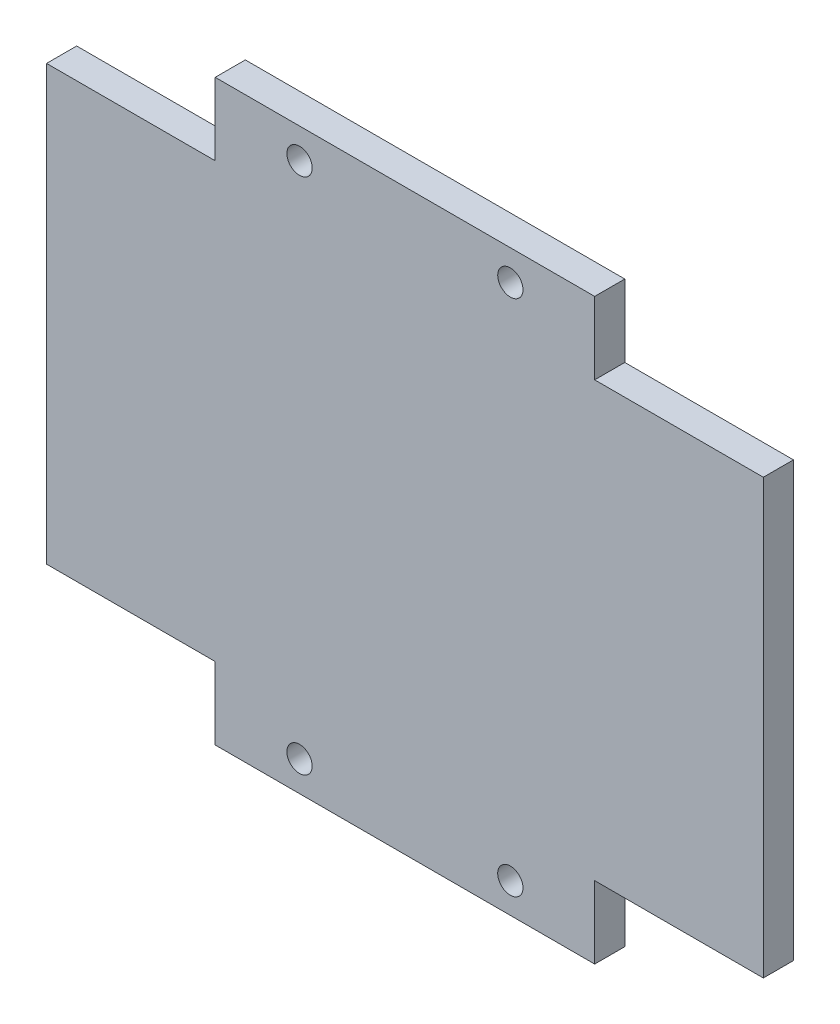
ISO-10303-21;
HEADER;
FILE_DESCRIPTION(('STEP AP214'),'2;1');
FILE_NAME('part.step','',(''),(''),'','','');
FILE_SCHEMA(('AUTOMOTIVE_DESIGN { 1 0 10303 214 1 1 1 1 }'));
ENDSEC;
DATA;
#1=APPLICATION_CONTEXT('core data for automotive mechanical design processes');
#2=APPLICATION_PROTOCOL_DEFINITION('international standard','automotive_design',2000,#1);
#3=PRODUCT_CONTEXT('',#1,'mechanical');
#4=PRODUCT('Part','Part','',(#3));
#5=PRODUCT_RELATED_PRODUCT_CATEGORY('part','',(#4));
#6=PRODUCT_DEFINITION_FORMATION('','',#4);
#7=PRODUCT_DEFINITION_CONTEXT('part definition',#1,'design');
#8=PRODUCT_DEFINITION('design','',#6,#7);
#9=PRODUCT_DEFINITION_SHAPE('','',#8);
#10=(LENGTH_UNIT() NAMED_UNIT(*) SI_UNIT(.MILLI.,.METRE.));
#11=(NAMED_UNIT(*) PLANE_ANGLE_UNIT() SI_UNIT($,.RADIAN.));
#12=(NAMED_UNIT(*) SI_UNIT($,.STERADIAN.) SOLID_ANGLE_UNIT());
#13=UNCERTAINTY_MEASURE_WITH_UNIT(LENGTH_MEASURE(1.E-05),#10,'distance_accuracy_value','');
#14=(GEOMETRIC_REPRESENTATION_CONTEXT(3) GLOBAL_UNCERTAINTY_ASSIGNED_CONTEXT((#13)) GLOBAL_UNIT_ASSIGNED_CONTEXT((#10,
#11,#12)) REPRESENTATION_CONTEXT('',''));
#15=CARTESIAN_POINT('',(0.,0.,0.));
#16=DIRECTION('',(0.,0.,1.));
#17=DIRECTION('',(1.,0.,0.));
#18=AXIS2_PLACEMENT_3D('',#15,#16,#17);
#19=CARTESIAN_POINT('',(0.,0.,5.));
#20=DIRECTION('',(1.,0.,0.));
#21=DIRECTION('',(0.,0.,-1.));
#22=AXIS2_PLACEMENT_3D('',#19,#20,#21);
#23=PLANE('',#22);
#24=DIRECTION('',(0.,0.,1.));
#25=VECTOR('',#24,1.);
#26=CARTESIAN_POINT('',(0.,12.,0.));
#27=LINE('',#26,#25);
#28=CARTESIAN_POINT('',(0.,12.,0.));
#29=VERTEX_POINT('',#28);
#30=CARTESIAN_POINT('',(0.,12.,5.));
#31=VERTEX_POINT('',#30);
#32=EDGE_CURVE('E135',#29,#31,#27,.T.);
#33=ORIENTED_EDGE('',*,*,#32,.F.);
#34=DIRECTION('',(0.,-1.,0.));
#35=VECTOR('',#34,1.);
#36=CARTESIAN_POINT('',(0.,0.,0.));
#37=LINE('',#36,#35);
#38=CARTESIAN_POINT('',(0.,0.,0.));
#39=VERTEX_POINT('',#38);
#40=EDGE_CURVE('E188',#29,#39,#37,.T.);
#41=ORIENTED_EDGE('',*,*,#40,.T.);
#42=DIRECTION('',(0.,0.,-1.));
#43=VECTOR('',#42,1.);
#44=CARTESIAN_POINT('',(0.,0.,5.));
#45=LINE('',#44,#43);
#46=CARTESIAN_POINT('',(0.,0.,5.));
#47=VERTEX_POINT('',#46);
#48=EDGE_CURVE('E11',#47,#39,#45,.T.);
#49=ORIENTED_EDGE('',*,*,#48,.F.);
#50=DIRECTION('',(0.,-1.,0.));
#51=VECTOR('',#50,1.);
#52=CARTESIAN_POINT('',(0.,0.,5.));
#53=LINE('',#52,#51);
#54=EDGE_CURVE('E151',#31,#47,#53,.T.);
#55=ORIENTED_EDGE('',*,*,#54,.F.);
#56=EDGE_LOOP('',(#33,#41,#49,#55));
#57=FACE_BOUND('',#56,.T.);
#58=ADVANCED_FACE('F45',(#57),#23,.F.);
#59=CARTESIAN_POINT('',(63.,0.,5.));
#60=DIRECTION('',(-1.,0.,0.));
#61=DIRECTION('',(0.,0.,1.));
#62=AXIS2_PLACEMENT_3D('',#59,#60,#61);
#63=PLANE('',#62);
#64=DIRECTION('',(0.,0.,1.));
#65=VECTOR('',#64,1.);
#66=CARTESIAN_POINT('',(63.,84.,0.));
#67=LINE('',#66,#65);
#68=CARTESIAN_POINT('',(63.,84.,0.));
#69=VERTEX_POINT('',#68);
#70=CARTESIAN_POINT('',(63.,84.,5.));
#71=VERTEX_POINT('',#70);
#72=EDGE_CURVE('E241',#69,#71,#67,.T.);
#73=ORIENTED_EDGE('',*,*,#72,.F.);
#74=DIRECTION('',(0.,1.,0.));
#75=VECTOR('',#74,1.);
#76=CARTESIAN_POINT('',(63.,0.,0.));
#77=LINE('',#76,#75);
#78=CARTESIAN_POINT('',(63.,96.,0.));
#79=VERTEX_POINT('',#78);
#80=EDGE_CURVE('E191',#69,#79,#77,.T.);
#81=ORIENTED_EDGE('',*,*,#80,.T.);
#82=DIRECTION('',(0.,0.,-1.));
#83=VECTOR('',#82,1.);
#84=CARTESIAN_POINT('',(63.,96.,5.));
#85=LINE('',#84,#83);
#86=CARTESIAN_POINT('',(63.,96.,5.));
#87=VERTEX_POINT('',#86);
#88=EDGE_CURVE('E198',#87,#79,#85,.T.);
#89=ORIENTED_EDGE('',*,*,#88,.F.);
#90=DIRECTION('',(0.,1.,0.));
#91=VECTOR('',#90,1.);
#92=CARTESIAN_POINT('',(63.,0.,5.));
#93=LINE('',#92,#91);
#94=EDGE_CURVE('E174',#71,#87,#93,.T.);
#95=ORIENTED_EDGE('',*,*,#94,.F.);
#96=EDGE_LOOP('',(#73,#81,#89,#95));
#97=FACE_BOUND('',#96,.T.);
#98=ADVANCED_FACE('F304',(#97),#63,.F.);
#99=CARTESIAN_POINT('',(0.,96.,0.));
#100=VERTEX_POINT('',#99);
#101=CARTESIAN_POINT('',(0.,84.,0.));
#102=VERTEX_POINT('',#101);
#103=EDGE_CURVE('E183',#100,#102,#37,.T.);
#104=ORIENTED_EDGE('',*,*,#103,.T.);
#105=DIRECTION('',(0.,0.,1.));
#106=VECTOR('',#105,1.);
#107=CARTESIAN_POINT('',(0.,84.,0.));
#108=LINE('',#107,#106);
#109=CARTESIAN_POINT('',(0.,84.,5.));
#110=VERTEX_POINT('',#109);
#111=EDGE_CURVE('E318',#102,#110,#108,.T.);
#112=ORIENTED_EDGE('',*,*,#111,.T.);
#113=CARTESIAN_POINT('',(0.,96.,5.));
#114=VERTEX_POINT('',#113);
#115=EDGE_CURVE('E160',#114,#110,#53,.T.);
#116=ORIENTED_EDGE('',*,*,#115,.F.);
#117=DIRECTION('',(0.,0.,-1.));
#118=VECTOR('',#117,1.);
#119=CARTESIAN_POINT('',(0.,96.,5.));
#120=LINE('',#119,#118);
#121=EDGE_CURVE('E182',#114,#100,#120,.T.);
#122=ORIENTED_EDGE('',*,*,#121,.T.);
#123=EDGE_LOOP('',(#104,#112,#116,#122));
#124=FACE_BOUND('',#123,.T.);
#125=ADVANCED_FACE('F47',(#124),#23,.F.);
#126=CARTESIAN_POINT('',(0.,0.,5.));
#127=DIRECTION('',(0.,1.,0.));
#128=DIRECTION('',(0.,0.,1.));
#129=AXIS2_PLACEMENT_3D('',#126,#127,#128);
#130=PLANE('',#129);
#131=DIRECTION('',(1.,0.,0.));
#132=VECTOR('',#131,1.);
#133=CARTESIAN_POINT('',(0.,0.,0.));
#134=LINE('',#133,#132);
#135=CARTESIAN_POINT('',(63.,0.,0.));
#136=VERTEX_POINT('',#135);
#137=EDGE_CURVE('E187',#39,#136,#134,.T.);
#138=ORIENTED_EDGE('',*,*,#137,.T.);
#139=DIRECTION('',(0.,0.,-1.));
#140=VECTOR('',#139,1.);
#141=CARTESIAN_POINT('',(63.,0.,5.));
#142=LINE('',#141,#140);
#143=CARTESIAN_POINT('',(63.,0.,5.));
#144=VERTEX_POINT('',#143);
#145=EDGE_CURVE('E54',#144,#136,#142,.T.);
#146=ORIENTED_EDGE('',*,*,#145,.F.);
#147=DIRECTION('',(1.,0.,0.));
#148=VECTOR('',#147,1.);
#149=CARTESIAN_POINT('',(0.,0.,5.));
#150=LINE('',#149,#148);
#151=EDGE_CURVE('E165',#47,#144,#150,.T.);
#152=ORIENTED_EDGE('',*,*,#151,.F.);
#153=ORIENTED_EDGE('',*,*,#48,.T.);
#154=EDGE_LOOP('',(#138,#146,#152,#153));
#155=FACE_BOUND('',#154,.T.);
#156=ADVANCED_FACE('F312',(#155),#130,.F.);
#157=CARTESIAN_POINT('',(63.,12.,0.));
#158=VERTEX_POINT('',#157);
#159=EDGE_CURVE('E166',#136,#158,#77,.T.);
#160=ORIENTED_EDGE('',*,*,#159,.T.);
#161=DIRECTION('',(0.,0.,1.));
#162=VECTOR('',#161,1.);
#163=CARTESIAN_POINT('',(63.,12.,0.));
#164=LINE('',#163,#162);
#165=CARTESIAN_POINT('',(63.,12.,5.));
#166=VERTEX_POINT('',#165);
#167=EDGE_CURVE('E235',#158,#166,#164,.T.);
#168=ORIENTED_EDGE('',*,*,#167,.T.);
#169=EDGE_CURVE('E175',#144,#166,#93,.T.);
#170=ORIENTED_EDGE('',*,*,#169,.F.);
#171=ORIENTED_EDGE('',*,*,#145,.T.);
#172=EDGE_LOOP('',(#160,#168,#170,#171));
#173=FACE_BOUND('',#172,.T.);
#174=ADVANCED_FACE('F207',(#173),#63,.F.);
#175=CARTESIAN_POINT('',(0.,96.,5.));
#176=DIRECTION('',(0.,-1.,0.));
#177=DIRECTION('',(0.,0.,-1.));
#178=AXIS2_PLACEMENT_3D('',#175,#176,#177);
#179=PLANE('',#178);
#180=DIRECTION('',(-1.,0.,0.));
#181=VECTOR('',#180,1.);
#182=CARTESIAN_POINT('',(0.,96.,0.));
#183=LINE('',#182,#181);
#184=EDGE_CURVE('E161',#79,#100,#183,.T.);
#185=ORIENTED_EDGE('',*,*,#184,.T.);
#186=ORIENTED_EDGE('',*,*,#121,.F.);
#187=DIRECTION('',(-1.,0.,0.));
#188=VECTOR('',#187,1.);
#189=CARTESIAN_POINT('',(0.,96.,5.));
#190=LINE('',#189,#188);
#191=EDGE_CURVE('E179',#87,#114,#190,.T.);
#192=ORIENTED_EDGE('',*,*,#191,.F.);
#193=ORIENTED_EDGE('',*,*,#88,.T.);
#194=EDGE_LOOP('',(#185,#186,#192,#193));
#195=FACE_BOUND('',#194,.T.);
#196=ADVANCED_FACE('F288',(#195),#179,.F.);
#197=CARTESIAN_POINT('',(0.,0.,5.));
#198=DIRECTION('',(0.,0.,-1.));
#199=DIRECTION('',(-1.,0.,0.));
#200=AXIS2_PLACEMENT_3D('',#197,#198,#199);
#201=PLANE('',#200);
#202=CARTESIAN_POINT('',(14.,5.,5.));
#203=DIRECTION('',(0.,0.,1.));
#204=DIRECTION('',(-1.,0.,0.));
#205=AXIS2_PLACEMENT_3D('',#202,#203,#204);
#206=CIRCLE('',#205,2.1);
#207=CARTESIAN_POINT('',(11.9,5.,5.));
#208=VERTEX_POINT('',#207);
#209=EDGE_CURVE('E269',#208,#208,#206,.T.);
#210=ORIENTED_EDGE('',*,*,#209,.F.);
#211=EDGE_LOOP('',(#210));
#212=FACE_BOUND('',#211,.T.);
#213=CARTESIAN_POINT('',(49.,5.00000000000002,5.));
#214=DIRECTION('',(0.,0.,1.));
#215=DIRECTION('',(1.,0.,0.));
#216=AXIS2_PLACEMENT_3D('',#213,#214,#215);
#217=CIRCLE('',#216,2.1);
#218=CARTESIAN_POINT('',(51.1,5.00000000000002,5.));
#219=VERTEX_POINT('',#218);
#220=EDGE_CURVE('E261',#219,#219,#217,.T.);
#221=ORIENTED_EDGE('',*,*,#220,.F.);
#222=EDGE_LOOP('',(#221));
#223=FACE_BOUND('',#222,.T.);
#224=CARTESIAN_POINT('',(49.,91.,5.));
#225=DIRECTION('',(0.,0.,1.));
#226=DIRECTION('',(-1.,0.,0.));
#227=AXIS2_PLACEMENT_3D('',#224,#225,#226);
#228=CIRCLE('',#227,2.1);
#229=CARTESIAN_POINT('',(46.9,91.,5.));
#230=VERTEX_POINT('',#229);
#231=EDGE_CURVE('E253',#230,#230,#228,.T.);
#232=ORIENTED_EDGE('',*,*,#231,.F.);
#233=EDGE_LOOP('',(#232));
#234=FACE_BOUND('',#233,.T.);
#235=CARTESIAN_POINT('',(14.,91.,5.));
#236=DIRECTION('',(0.,0.,1.));
#237=DIRECTION('',(1.,0.,0.));
#238=AXIS2_PLACEMENT_3D('',#235,#236,#237);
#239=CIRCLE('',#238,2.1);
#240=CARTESIAN_POINT('',(16.1,91.,5.));
#241=VERTEX_POINT('',#240);
#242=EDGE_CURVE('E170',#241,#241,#239,.T.);
#243=ORIENTED_EDGE('',*,*,#242,.F.);
#244=EDGE_LOOP('',(#243));
#245=FACE_BOUND('',#244,.T.);
#246=ORIENTED_EDGE('',*,*,#115,.T.);
#247=DIRECTION('',(-1.,0.,0.));
#248=VECTOR('',#247,1.);
#249=CARTESIAN_POINT('',(0.,84.,5.));
#250=LINE('',#249,#248);
#251=CARTESIAN_POINT('',(-28.,84.,5.));
#252=VERTEX_POINT('',#251);
#253=EDGE_CURVE('E61',#110,#252,#250,.T.);
#254=ORIENTED_EDGE('',*,*,#253,.T.);
#255=DIRECTION('',(0.,-1.,0.));
#256=VECTOR('',#255,1.);
#257=CARTESIAN_POINT('',(-28.,84.,5.));
#258=LINE('',#257,#256);
#259=CARTESIAN_POINT('',(-28.,12.,5.));
#260=VERTEX_POINT('',#259);
#261=EDGE_CURVE('E154',#252,#260,#258,.T.);
#262=ORIENTED_EDGE('',*,*,#261,.T.);
#263=DIRECTION('',(1.,0.,0.));
#264=VECTOR('',#263,1.);
#265=CARTESIAN_POINT('',(0.,12.,5.));
#266=LINE('',#265,#264);
#267=EDGE_CURVE('E138',#260,#31,#266,.T.);
#268=ORIENTED_EDGE('',*,*,#267,.T.);
#269=ORIENTED_EDGE('',*,*,#54,.T.);
#270=ORIENTED_EDGE('',*,*,#151,.T.);
#271=ORIENTED_EDGE('',*,*,#169,.T.);
#272=DIRECTION('',(1.,0.,0.));
#273=VECTOR('',#272,1.);
#274=CARTESIAN_POINT('',(63.,12.,5.));
#275=LINE('',#274,#273);
#276=CARTESIAN_POINT('',(91.,12.,5.));
#277=VERTEX_POINT('',#276);
#278=EDGE_CURVE('E69',#166,#277,#275,.T.);
#279=ORIENTED_EDGE('',*,*,#278,.T.);
#280=DIRECTION('',(0.,1.,0.));
#281=VECTOR('',#280,1.);
#282=CARTESIAN_POINT('',(91.,84.,5.));
#283=LINE('',#282,#281);
#284=CARTESIAN_POINT('',(91.,84.,5.));
#285=VERTEX_POINT('',#284);
#286=EDGE_CURVE('E228',#277,#285,#283,.T.);
#287=ORIENTED_EDGE('',*,*,#286,.T.);
#288=DIRECTION('',(-1.,0.,0.));
#289=VECTOR('',#288,1.);
#290=CARTESIAN_POINT('',(63.,84.,5.));
#291=LINE('',#290,#289);
#292=EDGE_CURVE('E221',#285,#71,#291,.T.);
#293=ORIENTED_EDGE('',*,*,#292,.T.);
#294=ORIENTED_EDGE('',*,*,#94,.T.);
#295=ORIENTED_EDGE('',*,*,#191,.T.);
#296=EDGE_LOOP('',(#246,#254,#262,#268,#269,#270,#271,#279,#287,#293,#294,#295));
#297=FACE_BOUND('',#296,.T.);
#298=ADVANCED_FACE('F150',(#212,#223,#234,#245,#297),#201,.F.);
#299=CARTESIAN_POINT('',(0.,0.,0.));
#300=DIRECTION('',(0.,0.,-1.));
#301=DIRECTION('',(-1.,0.,0.));
#302=AXIS2_PLACEMENT_3D('',#299,#300,#301);
#303=PLANE('',#302);
#304=CARTESIAN_POINT('',(14.,5.,0.));
#305=DIRECTION('',(0.,0.,1.));
#306=DIRECTION('',(-1.,0.,0.));
#307=AXIS2_PLACEMENT_3D('',#304,#305,#306);
#308=CIRCLE('',#307,2.1);
#309=CARTESIAN_POINT('',(11.9,5.,0.));
#310=VERTEX_POINT('',#309);
#311=EDGE_CURVE('E244',#310,#310,#308,.T.);
#312=ORIENTED_EDGE('',*,*,#311,.T.);
#313=EDGE_LOOP('',(#312));
#314=FACE_BOUND('',#313,.T.);
#315=CARTESIAN_POINT('',(49.,5.00000000000002,0.));
#316=DIRECTION('',(0.,0.,1.));
#317=DIRECTION('',(1.,0.,0.));
#318=AXIS2_PLACEMENT_3D('',#315,#316,#317);
#319=CIRCLE('',#318,2.1);
#320=CARTESIAN_POINT('',(51.1,5.00000000000002,0.));
#321=VERTEX_POINT('',#320);
#322=EDGE_CURVE('E265',#321,#321,#319,.T.);
#323=ORIENTED_EDGE('',*,*,#322,.T.);
#324=EDGE_LOOP('',(#323));
#325=FACE_BOUND('',#324,.T.);
#326=CARTESIAN_POINT('',(49.,91.,0.));
#327=DIRECTION('',(0.,0.,1.));
#328=DIRECTION('',(-1.,0.,0.));
#329=AXIS2_PLACEMENT_3D('',#326,#327,#328);
#330=CIRCLE('',#329,2.1);
#331=CARTESIAN_POINT('',(46.9,91.,0.));
#332=VERTEX_POINT('',#331);
#333=EDGE_CURVE('E257',#332,#332,#330,.T.);
#334=ORIENTED_EDGE('',*,*,#333,.T.);
#335=EDGE_LOOP('',(#334));
#336=FACE_BOUND('',#335,.T.);
#337=CARTESIAN_POINT('',(14.,91.,0.));
#338=DIRECTION('',(0.,0.,1.));
#339=DIRECTION('',(1.,0.,0.));
#340=AXIS2_PLACEMENT_3D('',#337,#338,#339);
#341=CIRCLE('',#340,2.1);
#342=CARTESIAN_POINT('',(16.1,91.,0.));
#343=VERTEX_POINT('',#342);
#344=EDGE_CURVE('E275',#343,#343,#341,.T.);
#345=ORIENTED_EDGE('',*,*,#344,.T.);
#346=EDGE_LOOP('',(#345));
#347=FACE_BOUND('',#346,.T.);
#348=ORIENTED_EDGE('',*,*,#103,.F.);
#349=ORIENTED_EDGE('',*,*,#184,.F.);
#350=ORIENTED_EDGE('',*,*,#80,.F.);
#351=DIRECTION('',(-1.,0.,0.));
#352=VECTOR('',#351,1.);
#353=CARTESIAN_POINT('',(63.,84.,0.));
#354=LINE('',#353,#352);
#355=CARTESIAN_POINT('',(91.,84.,0.));
#356=VERTEX_POINT('',#355);
#357=EDGE_CURVE('E225',#356,#69,#354,.T.);
#358=ORIENTED_EDGE('',*,*,#357,.F.);
#359=DIRECTION('',(0.,1.,0.));
#360=VECTOR('',#359,1.);
#361=CARTESIAN_POINT('',(91.,84.,0.));
#362=LINE('',#361,#360);
#363=CARTESIAN_POINT('',(91.,12.,0.));
#364=VERTEX_POINT('',#363);
#365=EDGE_CURVE('E219',#364,#356,#362,.T.);
#366=ORIENTED_EDGE('',*,*,#365,.F.);
#367=DIRECTION('',(1.,0.,0.));
#368=VECTOR('',#367,1.);
#369=CARTESIAN_POINT('',(63.,12.,0.));
#370=LINE('',#369,#368);
#371=EDGE_CURVE('E216',#158,#364,#370,.T.);
#372=ORIENTED_EDGE('',*,*,#371,.F.);
#373=ORIENTED_EDGE('',*,*,#159,.F.);
#374=ORIENTED_EDGE('',*,*,#137,.F.);
#375=ORIENTED_EDGE('',*,*,#40,.F.);
#376=DIRECTION('',(1.,0.,0.));
#377=VECTOR('',#376,1.);
#378=CARTESIAN_POINT('',(0.,12.,0.));
#379=LINE('',#378,#377);
#380=CARTESIAN_POINT('',(-28.,12.,0.));
#381=VERTEX_POINT('',#380);
#382=EDGE_CURVE('E140',#381,#29,#379,.T.);
#383=ORIENTED_EDGE('',*,*,#382,.F.);
#384=DIRECTION('',(0.,-1.,0.));
#385=VECTOR('',#384,1.);
#386=CARTESIAN_POINT('',(-28.,84.,0.));
#387=LINE('',#386,#385);
#388=CARTESIAN_POINT('',(-28.,84.,0.));
#389=VERTEX_POINT('',#388);
#390=EDGE_CURVE('E326',#389,#381,#387,.T.);
#391=ORIENTED_EDGE('',*,*,#390,.F.);
#392=DIRECTION('',(-1.,0.,0.));
#393=VECTOR('',#392,1.);
#394=CARTESIAN_POINT('',(0.,84.,0.));
#395=LINE('',#394,#393);
#396=EDGE_CURVE('E156',#102,#389,#395,.T.);
#397=ORIENTED_EDGE('',*,*,#396,.F.);
#398=EDGE_LOOP('',(#348,#349,#350,#358,#366,#372,#373,#374,#375,#383,#391,#397));
#399=FACE_BOUND('',#398,.T.);
#400=ADVANCED_FACE('F213',(#314,#325,#336,#347,#399),#303,.T.);
#401=CARTESIAN_POINT('',(14.,91.,0.));
#402=DIRECTION('',(0.,0.,1.));
#403=DIRECTION('',(1.,0.,0.));
#404=AXIS2_PLACEMENT_3D('',#401,#402,#403);
#405=CYLINDRICAL_SURFACE('',#404,2.1);
#406=ORIENTED_EDGE('',*,*,#344,.F.);
#407=EDGE_LOOP('',(#406));
#408=FACE_BOUND('',#407,.T.);
#409=ORIENTED_EDGE('',*,*,#242,.T.);
#410=EDGE_LOOP('',(#409));
#411=FACE_BOUND('',#410,.T.);
#412=ADVANCED_FACE('F285',(#408,#411),#405,.F.);
#413=CARTESIAN_POINT('',(49.,91.,0.));
#414=DIRECTION('',(0.,0.,1.));
#415=DIRECTION('',(1.,0.,0.));
#416=AXIS2_PLACEMENT_3D('',#413,#414,#415);
#417=CYLINDRICAL_SURFACE('',#416,2.1);
#418=ORIENTED_EDGE('',*,*,#333,.F.);
#419=EDGE_LOOP('',(#418));
#420=FACE_BOUND('',#419,.T.);
#421=ORIENTED_EDGE('',*,*,#231,.T.);
#422=EDGE_LOOP('',(#421));
#423=FACE_BOUND('',#422,.T.);
#424=ADVANCED_FACE('F367',(#420,#423),#417,.F.);
#425=CARTESIAN_POINT('',(49.,5.00000000000002,0.));
#426=DIRECTION('',(0.,0.,1.));
#427=DIRECTION('',(1.,0.,0.));
#428=AXIS2_PLACEMENT_3D('',#425,#426,#427);
#429=CYLINDRICAL_SURFACE('',#428,2.1);
#430=ORIENTED_EDGE('',*,*,#322,.F.);
#431=EDGE_LOOP('',(#430));
#432=FACE_BOUND('',#431,.T.);
#433=ORIENTED_EDGE('',*,*,#220,.T.);
#434=EDGE_LOOP('',(#433));
#435=FACE_BOUND('',#434,.T.);
#436=ADVANCED_FACE('F370',(#432,#435),#429,.F.);
#437=CARTESIAN_POINT('',(14.,5.,0.));
#438=DIRECTION('',(0.,0.,1.));
#439=DIRECTION('',(1.,0.,0.));
#440=AXIS2_PLACEMENT_3D('',#437,#438,#439);
#441=CYLINDRICAL_SURFACE('',#440,2.1);
#442=ORIENTED_EDGE('',*,*,#311,.F.);
#443=EDGE_LOOP('',(#442));
#444=FACE_BOUND('',#443,.T.);
#445=ORIENTED_EDGE('',*,*,#209,.T.);
#446=EDGE_LOOP('',(#445));
#447=FACE_BOUND('',#446,.T.);
#448=ADVANCED_FACE('F374',(#444,#447),#441,.F.);
#449=CARTESIAN_POINT('',(63.,84.,0.));
#450=DIRECTION('',(0.,1.,0.));
#451=DIRECTION('',(0.,0.,1.));
#452=AXIS2_PLACEMENT_3D('',#449,#450,#451);
#453=PLANE('',#452);
#454=ORIENTED_EDGE('',*,*,#292,.F.);
#455=DIRECTION('',(0.,0.,1.));
#456=VECTOR('',#455,1.);
#457=CARTESIAN_POINT('',(91.,84.,0.));
#458=LINE('',#457,#456);
#459=EDGE_CURVE('E245',#356,#285,#458,.T.);
#460=ORIENTED_EDGE('',*,*,#459,.F.);
#461=ORIENTED_EDGE('',*,*,#357,.T.);
#462=ORIENTED_EDGE('',*,*,#72,.T.);
#463=EDGE_LOOP('',(#454,#460,#461,#462));
#464=FACE_BOUND('',#463,.T.);
#465=ADVANCED_FACE('F352',(#464),#453,.T.);
#466=CARTESIAN_POINT('',(91.,84.,0.));
#467=DIRECTION('',(1.,0.,0.));
#468=DIRECTION('',(0.,1.,0.));
#469=AXIS2_PLACEMENT_3D('',#466,#467,#468);
#470=PLANE('',#469);
#471=ORIENTED_EDGE('',*,*,#286,.F.);
#472=DIRECTION('',(0.,0.,1.));
#473=VECTOR('',#472,1.);
#474=CARTESIAN_POINT('',(91.,12.,0.));
#475=LINE('',#474,#473);
#476=EDGE_CURVE('E248',#364,#277,#475,.T.);
#477=ORIENTED_EDGE('',*,*,#476,.F.);
#478=ORIENTED_EDGE('',*,*,#365,.T.);
#479=ORIENTED_EDGE('',*,*,#459,.T.);
#480=EDGE_LOOP('',(#471,#477,#478,#479));
#481=FACE_BOUND('',#480,.T.);
#482=ADVANCED_FACE('F355',(#481),#470,.T.);
#483=CARTESIAN_POINT('',(63.,12.,0.));
#484=DIRECTION('',(0.,-1.,0.));
#485=DIRECTION('',(1.,0.,0.));
#486=AXIS2_PLACEMENT_3D('',#483,#484,#485);
#487=PLANE('',#486);
#488=ORIENTED_EDGE('',*,*,#278,.F.);
#489=ORIENTED_EDGE('',*,*,#167,.F.);
#490=ORIENTED_EDGE('',*,*,#371,.T.);
#491=ORIENTED_EDGE('',*,*,#476,.T.);
#492=EDGE_LOOP('',(#488,#489,#490,#491));
#493=FACE_BOUND('',#492,.T.);
#494=ADVANCED_FACE('F356',(#493),#487,.T.);
#495=CARTESIAN_POINT('',(0.,12.,0.));
#496=DIRECTION('',(0.,-1.,0.));
#497=DIRECTION('',(0.,0.,-1.));
#498=AXIS2_PLACEMENT_3D('',#495,#496,#497);
#499=PLANE('',#498);
#500=ORIENTED_EDGE('',*,*,#267,.F.);
#501=DIRECTION('',(0.,0.,1.));
#502=VECTOR('',#501,1.);
#503=CARTESIAN_POINT('',(-28.,12.,0.));
#504=LINE('',#503,#502);
#505=EDGE_CURVE('E145',#381,#260,#504,.T.);
#506=ORIENTED_EDGE('',*,*,#505,.F.);
#507=ORIENTED_EDGE('',*,*,#382,.T.);
#508=ORIENTED_EDGE('',*,*,#32,.T.);
#509=EDGE_LOOP('',(#500,#506,#507,#508));
#510=FACE_BOUND('',#509,.T.);
#511=ADVANCED_FACE('F137',(#510),#499,.T.);
#512=CARTESIAN_POINT('',(-28.,84.,0.));
#513=DIRECTION('',(-1.,0.,0.));
#514=DIRECTION('',(0.,-1.,0.));
#515=AXIS2_PLACEMENT_3D('',#512,#513,#514);
#516=PLANE('',#515);
#517=ORIENTED_EDGE('',*,*,#261,.F.);
#518=DIRECTION('',(0.,0.,1.));
#519=VECTOR('',#518,1.);
#520=CARTESIAN_POINT('',(-28.,84.,0.));
#521=LINE('',#520,#519);
#522=EDGE_CURVE('E339',#389,#252,#521,.T.);
#523=ORIENTED_EDGE('',*,*,#522,.F.);
#524=ORIENTED_EDGE('',*,*,#390,.T.);
#525=ORIENTED_EDGE('',*,*,#505,.T.);
#526=EDGE_LOOP('',(#517,#523,#524,#525));
#527=FACE_BOUND('',#526,.T.);
#528=ADVANCED_FACE('F344',(#527),#516,.T.);
#529=CARTESIAN_POINT('',(0.,84.,0.));
#530=DIRECTION('',(0.,1.,0.));
#531=DIRECTION('',(0.,0.,1.));
#532=AXIS2_PLACEMENT_3D('',#529,#530,#531);
#533=PLANE('',#532);
#534=ORIENTED_EDGE('',*,*,#253,.F.);
#535=ORIENTED_EDGE('',*,*,#111,.F.);
#536=ORIENTED_EDGE('',*,*,#396,.T.);
#537=ORIENTED_EDGE('',*,*,#522,.T.);
#538=EDGE_LOOP('',(#534,#535,#536,#537));
#539=FACE_BOUND('',#538,.T.);
#540=ADVANCED_FACE('F343',(#539),#533,.T.);
#541=CLOSED_SHELL('',(#58,#98,#125,#156,#174,#196,#298,#400,#412,#424,#436,#448,#465,#482,#494,
#511,#528,#540));
#542=MANIFOLD_SOLID_BREP('B2',#541);
#543=ADVANCED_BREP_SHAPE_REPRESENTATION('',(#18,#542),#14);
#544=SHAPE_DEFINITION_REPRESENTATION(#9,#543);
ENDSEC;
END-ISO-10303-21;
